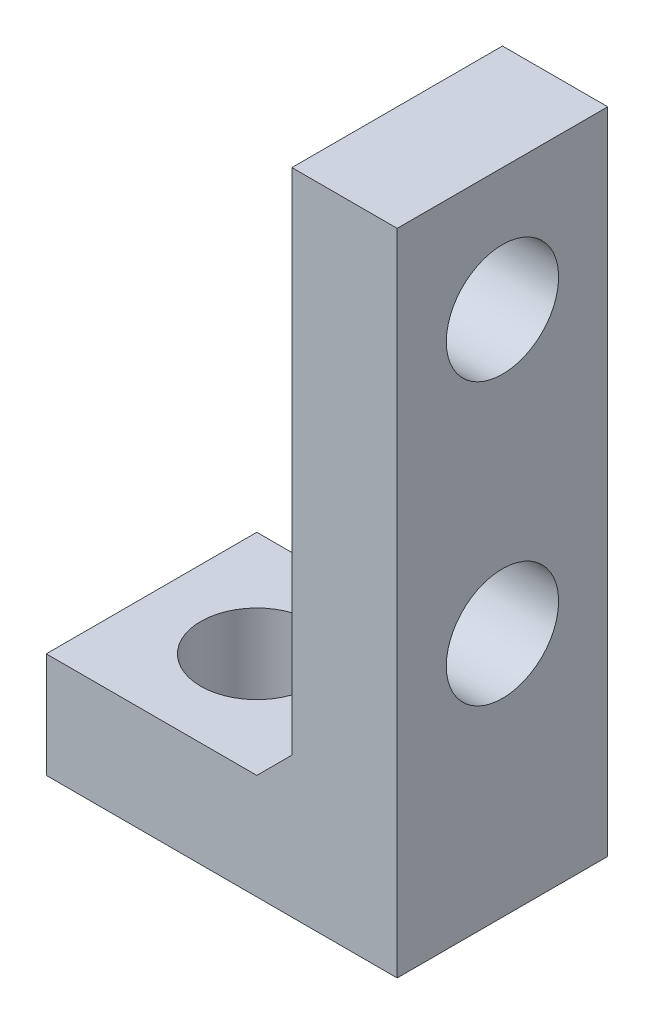
ISO-10303-21;
HEADER;
FILE_DESCRIPTION(('STEP AP214'),'2;1');
FILE_NAME('part.step','',(''),(''),'','','');
FILE_SCHEMA(('AUTOMOTIVE_DESIGN { 1 0 10303 214 1 1 1 1 }'));
ENDSEC;
DATA;
#1=APPLICATION_CONTEXT('core data for automotive mechanical design processes');
#2=APPLICATION_PROTOCOL_DEFINITION('international standard','automotive_design',2000,#1);
#3=PRODUCT_CONTEXT('',#1,'mechanical');
#4=PRODUCT('Part','Part','',(#3));
#5=PRODUCT_RELATED_PRODUCT_CATEGORY('part','',(#4));
#6=PRODUCT_DEFINITION_FORMATION('','',#4);
#7=PRODUCT_DEFINITION_CONTEXT('part definition',#1,'design');
#8=PRODUCT_DEFINITION('design','',#6,#7);
#9=PRODUCT_DEFINITION_SHAPE('','',#8);
#10=(LENGTH_UNIT() NAMED_UNIT(*) SI_UNIT(.MILLI.,.METRE.));
#11=(NAMED_UNIT(*) PLANE_ANGLE_UNIT() SI_UNIT($,.RADIAN.));
#12=(NAMED_UNIT(*) SI_UNIT($,.STERADIAN.) SOLID_ANGLE_UNIT());
#13=UNCERTAINTY_MEASURE_WITH_UNIT(LENGTH_MEASURE(1.E-05),#10,'distance_accuracy_value','');
#14=(GEOMETRIC_REPRESENTATION_CONTEXT(3) GLOBAL_UNCERTAINTY_ASSIGNED_CONTEXT((#13)) GLOBAL_UNIT_ASSIGNED_CONTEXT((#10,
#11,#12)) REPRESENTATION_CONTEXT('',''));
#15=CARTESIAN_POINT('',(0.,0.,0.));
#16=DIRECTION('',(0.,0.,1.));
#17=DIRECTION('',(1.,0.,0.));
#18=AXIS2_PLACEMENT_3D('',#15,#16,#17);
#19=CARTESIAN_POINT('',(0.,3.,0.));
#20=DIRECTION('',(0.,-1.,0.));
#21=DIRECTION('',(0.,0.,-1.));
#22=AXIS2_PLACEMENT_3D('',#19,#20,#21);
#23=PLANE('',#22);
#24=CARTESIAN_POINT('',(-2.,3.,0.));
#25=DIRECTION('',(0.,1.,0.));
#26=DIRECTION('',(0.,0.,1.));
#27=AXIS2_PLACEMENT_3D('',#24,#25,#26);
#28=CIRCLE('',#27,1.6);
#29=CARTESIAN_POINT('',(-2.,3.,1.6));
#30=VERTEX_POINT('',#29);
#31=EDGE_CURVE('E97',#30,#30,#28,.T.);
#32=ORIENTED_EDGE('',*,*,#31,.F.);
#33=EDGE_LOOP('',(#32));
#34=FACE_BOUND('',#33,.T.);
#35=DIRECTION('',(1.,0.,0.));
#36=VECTOR('',#35,1.);
#37=CARTESIAN_POINT('',(-5.,3.,3.));
#38=LINE('',#37,#36);
#39=CARTESIAN_POINT('',(-5.,3.,3.));
#40=VERTEX_POINT('',#39);
#41=CARTESIAN_POINT('',(1.,3.,3.));
#42=VERTEX_POINT('',#41);
#43=EDGE_CURVE('E92',#40,#42,#38,.T.);
#44=ORIENTED_EDGE('',*,*,#43,.T.);
#45=DIRECTION('',(0.,0.,1.));
#46=VECTOR('',#45,1.);
#47=CARTESIAN_POINT('',(1.,3.,-3.));
#48=LINE('',#47,#46);
#49=CARTESIAN_POINT('',(1.,3.,-3.));
#50=VERTEX_POINT('',#49);
#51=EDGE_CURVE('E139',#50,#42,#48,.T.);
#52=ORIENTED_EDGE('',*,*,#51,.F.);
#53=DIRECTION('',(-1.,0.,0.));
#54=VECTOR('',#53,1.);
#55=CARTESIAN_POINT('',(-5.,3.,-3.));
#56=LINE('',#55,#54);
#57=CARTESIAN_POINT('',(-5.,3.,-3.));
#58=VERTEX_POINT('',#57);
#59=EDGE_CURVE('E83',#50,#58,#56,.T.);
#60=ORIENTED_EDGE('',*,*,#59,.T.);
#61=DIRECTION('',(0.,0.,1.));
#62=VECTOR('',#61,1.);
#63=CARTESIAN_POINT('',(-5.,3.,3.));
#64=LINE('',#63,#62);
#65=EDGE_CURVE('E50',#58,#40,#64,.T.);
#66=ORIENTED_EDGE('',*,*,#65,.T.);
#67=EDGE_LOOP('',(#44,#52,#60,#66));
#68=FACE_BOUND('',#67,.T.);
#69=ADVANCED_FACE('F33',(#34,#68),#23,.F.);
#70=CARTESIAN_POINT('',(0.,0.,0.));
#71=DIRECTION('',(0.,-1.,0.));
#72=DIRECTION('',(0.,0.,-1.));
#73=AXIS2_PLACEMENT_3D('',#70,#71,#72);
#74=PLANE('',#73);
#75=DIRECTION('',(0.,0.,-1.));
#76=VECTOR('',#75,1.);
#77=CARTESIAN_POINT('',(5.,0.,3.));
#78=LINE('',#77,#76);
#79=CARTESIAN_POINT('',(5.,0.,3.));
#80=VERTEX_POINT('',#79);
#81=CARTESIAN_POINT('',(5.,0.,-3.));
#82=VERTEX_POINT('',#81);
#83=EDGE_CURVE('E89',#80,#82,#78,.T.);
#84=ORIENTED_EDGE('',*,*,#83,.F.);
#85=DIRECTION('',(1.,0.,0.));
#86=VECTOR('',#85,1.);
#87=CARTESIAN_POINT('',(-5.,0.,3.));
#88=LINE('',#87,#86);
#89=CARTESIAN_POINT('',(-5.,0.,3.));
#90=VERTEX_POINT('',#89);
#91=EDGE_CURVE('E72',#90,#80,#88,.T.);
#92=ORIENTED_EDGE('',*,*,#91,.F.);
#93=DIRECTION('',(0.,0.,1.));
#94=VECTOR('',#93,1.);
#95=CARTESIAN_POINT('',(-5.,0.,3.));
#96=LINE('',#95,#94);
#97=CARTESIAN_POINT('',(-5.,0.,-3.));
#98=VERTEX_POINT('',#97);
#99=EDGE_CURVE('E66',#98,#90,#96,.T.);
#100=ORIENTED_EDGE('',*,*,#99,.F.);
#101=DIRECTION('',(-1.,0.,0.));
#102=VECTOR('',#101,1.);
#103=CARTESIAN_POINT('',(-5.,0.,-3.));
#104=LINE('',#103,#102);
#105=EDGE_CURVE('E96',#82,#98,#104,.T.);
#106=ORIENTED_EDGE('',*,*,#105,.F.);
#107=EDGE_LOOP('',(#84,#92,#100,#106));
#108=FACE_BOUND('',#107,.T.);
#109=CARTESIAN_POINT('',(-2.,0.,0.));
#110=DIRECTION('',(0.,1.,0.));
#111=DIRECTION('',(0.,0.,1.));
#112=AXIS2_PLACEMENT_3D('',#109,#110,#111);
#113=CIRCLE('',#112,1.6);
#114=CARTESIAN_POINT('',(-2.,0.,1.6));
#115=VERTEX_POINT('',#114);
#116=EDGE_CURVE('E101',#115,#115,#113,.T.);
#117=ORIENTED_EDGE('',*,*,#116,.T.);
#118=EDGE_LOOP('',(#117));
#119=FACE_BOUND('',#118,.T.);
#120=ADVANCED_FACE('F94',(#108,#119),#74,.T.);
#121=CARTESIAN_POINT('',(5.,3.,3.));
#122=DIRECTION('',(-1.,0.,0.));
#123=DIRECTION('',(0.,0.,1.));
#124=AXIS2_PLACEMENT_3D('',#121,#122,#123);
#125=PLANE('',#124);
#126=CARTESIAN_POINT('',(5.,7.,0.));
#127=DIRECTION('',(-1.,0.,0.));
#128=DIRECTION('',(0.,0.,1.));
#129=AXIS2_PLACEMENT_3D('',#126,#127,#128);
#130=CIRCLE('',#129,1.6);
#131=CARTESIAN_POINT('',(5.,7.,1.6));
#132=VERTEX_POINT('',#131);
#133=EDGE_CURVE('E159',#132,#132,#130,.T.);
#134=ORIENTED_EDGE('',*,*,#133,.T.);
#135=EDGE_LOOP('',(#134));
#136=FACE_BOUND('',#135,.T.);
#137=CARTESIAN_POINT('',(5.,15.,0.));
#138=DIRECTION('',(-1.,0.,0.));
#139=DIRECTION('',(0.,0.,1.));
#140=AXIS2_PLACEMENT_3D('',#137,#138,#139);
#141=CIRCLE('',#140,1.6);
#142=CARTESIAN_POINT('',(5.,15.,1.59999999999997));
#143=VERTEX_POINT('',#142);
#144=EDGE_CURVE('E165',#143,#143,#141,.T.);
#145=ORIENTED_EDGE('',*,*,#144,.T.);
#146=EDGE_LOOP('',(#145));
#147=FACE_BOUND('',#146,.T.);
#148=ORIENTED_EDGE('',*,*,#83,.T.);
#149=DIRECTION('',(0.,-1.,0.));
#150=VECTOR('',#149,1.);
#151=CARTESIAN_POINT('',(5.,3.,-3.));
#152=LINE('',#151,#150);
#153=CARTESIAN_POINT('',(5.,18.5,-3.));
#154=VERTEX_POINT('',#153);
#155=EDGE_CURVE('E11',#154,#82,#152,.T.);
#156=ORIENTED_EDGE('',*,*,#155,.F.);
#157=DIRECTION('',(0.,0.,-1.));
#158=VECTOR('',#157,1.);
#159=CARTESIAN_POINT('',(5.,18.5,-3.));
#160=LINE('',#159,#158);
#161=CARTESIAN_POINT('',(5.,18.5,3.));
#162=VERTEX_POINT('',#161);
#163=EDGE_CURVE('E91',#162,#154,#160,.T.);
#164=ORIENTED_EDGE('',*,*,#163,.F.);
#165=DIRECTION('',(0.,-1.,0.));
#166=VECTOR('',#165,1.);
#167=CARTESIAN_POINT('',(5.,3.,3.));
#168=LINE('',#167,#166);
#169=EDGE_CURVE('E77',#162,#80,#168,.T.);
#170=ORIENTED_EDGE('',*,*,#169,.T.);
#171=EDGE_LOOP('',(#148,#156,#164,#170));
#172=FACE_BOUND('',#171,.T.);
#173=ADVANCED_FACE('F35',(#136,#147,#172),#125,.F.);
#174=CARTESIAN_POINT('',(-5.,3.,-3.));
#175=DIRECTION('',(0.,0.,1.));
#176=DIRECTION('',(1.,0.,0.));
#177=AXIS2_PLACEMENT_3D('',#174,#175,#176);
#178=PLANE('',#177);
#179=ORIENTED_EDGE('',*,*,#59,.F.);
#180=DIRECTION('',(-0.707106781186546,-0.707106781186548,0.));
#181=VECTOR('',#180,1.);
#182=CARTESIAN_POINT('',(1.,3.,-3.));
#183=LINE('',#182,#181);
#184=CARTESIAN_POINT('',(2.,4.,-3.));
#185=VERTEX_POINT('',#184);
#186=EDGE_CURVE('E150',#185,#50,#183,.T.);
#187=ORIENTED_EDGE('',*,*,#186,.F.);
#188=DIRECTION('',(0.,-1.,0.));
#189=VECTOR('',#188,1.);
#190=CARTESIAN_POINT('',(2.,18.5,-3.));
#191=LINE('',#190,#189);
#192=CARTESIAN_POINT('',(2.,18.5,-3.));
#193=VERTEX_POINT('',#192);
#194=EDGE_CURVE('E126',#193,#185,#191,.T.);
#195=ORIENTED_EDGE('',*,*,#194,.F.);
#196=DIRECTION('',(-1.,0.,0.));
#197=VECTOR('',#196,1.);
#198=CARTESIAN_POINT('',(5.,18.5,-3.));
#199=LINE('',#198,#197);
#200=EDGE_CURVE('E117',#154,#193,#199,.T.);
#201=ORIENTED_EDGE('',*,*,#200,.F.);
#202=ORIENTED_EDGE('',*,*,#155,.T.);
#203=ORIENTED_EDGE('',*,*,#105,.T.);
#204=DIRECTION('',(0.,-1.,0.));
#205=VECTOR('',#204,1.);
#206=CARTESIAN_POINT('',(-5.,3.,-3.));
#207=LINE('',#206,#205);
#208=EDGE_CURVE('E42',#58,#98,#207,.T.);
#209=ORIENTED_EDGE('',*,*,#208,.F.);
#210=EDGE_LOOP('',(#179,#187,#195,#201,#202,#203,#209));
#211=FACE_BOUND('',#210,.T.);
#212=ADVANCED_FACE('F111',(#211),#178,.F.);
#213=CARTESIAN_POINT('',(-5.,3.,3.));
#214=DIRECTION('',(1.,0.,0.));
#215=DIRECTION('',(0.,0.,-1.));
#216=AXIS2_PLACEMENT_3D('',#213,#214,#215);
#217=PLANE('',#216);
#218=ORIENTED_EDGE('',*,*,#99,.T.);
#219=DIRECTION('',(0.,-1.,0.));
#220=VECTOR('',#219,1.);
#221=CARTESIAN_POINT('',(-5.,3.,3.));
#222=LINE('',#221,#220);
#223=EDGE_CURVE('E80',#40,#90,#222,.T.);
#224=ORIENTED_EDGE('',*,*,#223,.F.);
#225=ORIENTED_EDGE('',*,*,#65,.F.);
#226=ORIENTED_EDGE('',*,*,#208,.T.);
#227=EDGE_LOOP('',(#218,#224,#225,#226));
#228=FACE_BOUND('',#227,.T.);
#229=ADVANCED_FACE('F108',(#228),#217,.F.);
#230=CARTESIAN_POINT('',(-5.,3.,3.));
#231=DIRECTION('',(0.,0.,-1.));
#232=DIRECTION('',(-1.,0.,0.));
#233=AXIS2_PLACEMENT_3D('',#230,#231,#232);
#234=PLANE('',#233);
#235=ORIENTED_EDGE('',*,*,#91,.T.);
#236=ORIENTED_EDGE('',*,*,#169,.F.);
#237=DIRECTION('',(1.,0.,0.));
#238=VECTOR('',#237,1.);
#239=CARTESIAN_POINT('',(5.,18.5,3.));
#240=LINE('',#239,#238);
#241=CARTESIAN_POINT('',(2.,18.5,3.));
#242=VERTEX_POINT('',#241);
#243=EDGE_CURVE('E122',#242,#162,#240,.T.);
#244=ORIENTED_EDGE('',*,*,#243,.F.);
#245=DIRECTION('',(0.,-1.,0.));
#246=VECTOR('',#245,1.);
#247=CARTESIAN_POINT('',(2.,18.5,3.));
#248=LINE('',#247,#246);
#249=CARTESIAN_POINT('',(2.,4.,3.));
#250=VERTEX_POINT('',#249);
#251=EDGE_CURVE('E123',#242,#250,#248,.T.);
#252=ORIENTED_EDGE('',*,*,#251,.T.);
#253=DIRECTION('',(-0.707106781186546,-0.707106781186548,0.));
#254=VECTOR('',#253,1.);
#255=CARTESIAN_POINT('',(1.,3.,3.));
#256=LINE('',#255,#254);
#257=EDGE_CURVE('E145',#250,#42,#256,.T.);
#258=ORIENTED_EDGE('',*,*,#257,.T.);
#259=ORIENTED_EDGE('',*,*,#43,.F.);
#260=ORIENTED_EDGE('',*,*,#223,.T.);
#261=EDGE_LOOP('',(#235,#236,#244,#252,#258,#259,#260));
#262=FACE_BOUND('',#261,.T.);
#263=ADVANCED_FACE('F74',(#262),#234,.F.);
#264=CARTESIAN_POINT('',(-2.,3.,0.));
#265=DIRECTION('',(0.,-1.,0.));
#266=DIRECTION('',(0.,0.,-1.));
#267=AXIS2_PLACEMENT_3D('',#264,#265,#266);
#268=CYLINDRICAL_SURFACE('',#267,1.6);
#269=ORIENTED_EDGE('',*,*,#31,.T.);
#270=EDGE_LOOP('',(#269));
#271=FACE_BOUND('',#270,.T.);
#272=ORIENTED_EDGE('',*,*,#116,.F.);
#273=EDGE_LOOP('',(#272));
#274=FACE_BOUND('',#273,.T.);
#275=ADVANCED_FACE('F202',(#271,#274),#268,.F.);
#276=CARTESIAN_POINT('',(2.,18.5,-3.));
#277=DIRECTION('',(1.,0.,0.));
#278=DIRECTION('',(0.,0.,-1.));
#279=AXIS2_PLACEMENT_3D('',#276,#277,#278);
#280=PLANE('',#279);
#281=CARTESIAN_POINT('',(2.,7.,0.));
#282=DIRECTION('',(-1.,0.,0.));
#283=DIRECTION('',(0.,0.,1.));
#284=AXIS2_PLACEMENT_3D('',#281,#282,#283);
#285=CIRCLE('',#284,1.6);
#286=CARTESIAN_POINT('',(2.,7.,1.6));
#287=VERTEX_POINT('',#286);
#288=EDGE_CURVE('E162',#287,#287,#285,.T.);
#289=ORIENTED_EDGE('',*,*,#288,.F.);
#290=EDGE_LOOP('',(#289));
#291=FACE_BOUND('',#290,.T.);
#292=CARTESIAN_POINT('',(2.,15.,0.));
#293=DIRECTION('',(-1.,0.,0.));
#294=DIRECTION('',(0.,0.,1.));
#295=AXIS2_PLACEMENT_3D('',#292,#293,#294);
#296=CIRCLE('',#295,1.6);
#297=CARTESIAN_POINT('',(2.,15.,1.59999999999997));
#298=VERTEX_POINT('',#297);
#299=EDGE_CURVE('E157',#298,#298,#296,.T.);
#300=ORIENTED_EDGE('',*,*,#299,.F.);
#301=EDGE_LOOP('',(#300));
#302=FACE_BOUND('',#301,.T.);
#303=ORIENTED_EDGE('',*,*,#194,.T.);
#304=DIRECTION('',(0.,0.,1.));
#305=VECTOR('',#304,1.);
#306=CARTESIAN_POINT('',(2.,4.,-3.));
#307=LINE('',#306,#305);
#308=EDGE_CURVE('E153',#185,#250,#307,.T.);
#309=ORIENTED_EDGE('',*,*,#308,.T.);
#310=ORIENTED_EDGE('',*,*,#251,.F.);
#311=DIRECTION('',(0.,0.,1.));
#312=VECTOR('',#311,1.);
#313=CARTESIAN_POINT('',(2.,18.5,-3.));
#314=LINE('',#313,#312);
#315=EDGE_CURVE('E128',#193,#242,#314,.T.);
#316=ORIENTED_EDGE('',*,*,#315,.F.);
#317=EDGE_LOOP('',(#303,#309,#310,#316));
#318=FACE_BOUND('',#317,.T.);
#319=ADVANCED_FACE('F174',(#291,#302,#318),#280,.F.);
#320=CARTESIAN_POINT('',(0.,18.5,0.));
#321=DIRECTION('',(0.,1.,0.));
#322=DIRECTION('',(0.,0.,1.));
#323=AXIS2_PLACEMENT_3D('',#320,#321,#322);
#324=PLANE('',#323);
#325=ORIENTED_EDGE('',*,*,#200,.T.);
#326=ORIENTED_EDGE('',*,*,#315,.T.);
#327=ORIENTED_EDGE('',*,*,#243,.T.);
#328=ORIENTED_EDGE('',*,*,#163,.T.);
#329=EDGE_LOOP('',(#325,#326,#327,#328));
#330=FACE_BOUND('',#329,.T.);
#331=ADVANCED_FACE('F119',(#330),#324,.T.);
#332=CARTESIAN_POINT('',(5.,15.,0.));
#333=DIRECTION('',(-1.,0.,0.));
#334=DIRECTION('',(0.,0.,1.));
#335=AXIS2_PLACEMENT_3D('',#332,#333,#334);
#336=CYLINDRICAL_SURFACE('',#335,1.6);
#337=ORIENTED_EDGE('',*,*,#144,.F.);
#338=EDGE_LOOP('',(#337));
#339=FACE_BOUND('',#338,.T.);
#340=ORIENTED_EDGE('',*,*,#299,.T.);
#341=EDGE_LOOP('',(#340));
#342=FACE_BOUND('',#341,.T.);
#343=ADVANCED_FACE('F188',(#339,#342),#336,.F.);
#344=CARTESIAN_POINT('',(5.,7.,0.));
#345=DIRECTION('',(-1.,0.,0.));
#346=DIRECTION('',(0.,0.,1.));
#347=AXIS2_PLACEMENT_3D('',#344,#345,#346);
#348=CYLINDRICAL_SURFACE('',#347,1.6);
#349=ORIENTED_EDGE('',*,*,#133,.F.);
#350=EDGE_LOOP('',(#349));
#351=FACE_BOUND('',#350,.T.);
#352=ORIENTED_EDGE('',*,*,#288,.T.);
#353=EDGE_LOOP('',(#352));
#354=FACE_BOUND('',#353,.T.);
#355=ADVANCED_FACE('F182',(#351,#354),#348,.F.);
#356=CARTESIAN_POINT('',(1.,3.,-3.));
#357=DIRECTION('',(-0.707106781186549,0.707106781186547,0.));
#358=DIRECTION('',(-0.707106781186547,-0.707106781186549,0.));
#359=AXIS2_PLACEMENT_3D('',#356,#357,#358);
#360=PLANE('',#359);
#361=ORIENTED_EDGE('',*,*,#257,.F.);
#362=ORIENTED_EDGE('',*,*,#308,.F.);
#363=ORIENTED_EDGE('',*,*,#186,.T.);
#364=ORIENTED_EDGE('',*,*,#51,.T.);
#365=EDGE_LOOP('',(#361,#362,#363,#364));
#366=FACE_BOUND('',#365,.T.);
#367=ADVANCED_FACE('F176',(#366),#360,.T.);
#368=CLOSED_SHELL('',(#69,#120,#173,#212,#229,#263,#275,#319,#331,#343,#355,#367));
#369=MANIFOLD_SOLID_BREP('B2',#368);
#370=ADVANCED_BREP_SHAPE_REPRESENTATION('',(#18,#369),#14);
#371=SHAPE_DEFINITION_REPRESENTATION(#9,#370);
ENDSEC;
END-ISO-10303-21;
